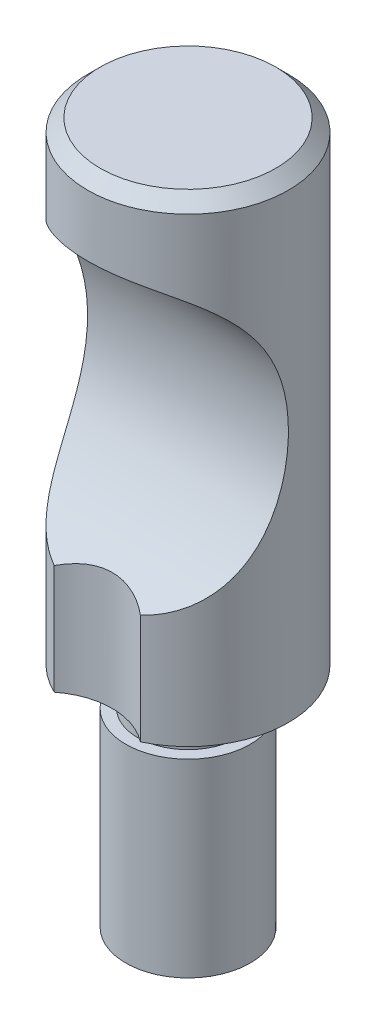
ISO-10303-21;
HEADER;
FILE_DESCRIPTION(('STEP AP214'),'2;1');
FILE_NAME('part.step','',(''),(''),'','','');
FILE_SCHEMA(('AUTOMOTIVE_DESIGN { 1 0 10303 214 1 1 1 1 }'));
ENDSEC;
DATA;
#1=APPLICATION_CONTEXT('core data for automotive mechanical design processes');
#2=APPLICATION_PROTOCOL_DEFINITION('international standard','automotive_design',2000,#1);
#3=PRODUCT_CONTEXT('',#1,'mechanical');
#4=PRODUCT('Part','Part','',(#3));
#5=PRODUCT_RELATED_PRODUCT_CATEGORY('part','',(#4));
#6=PRODUCT_DEFINITION_FORMATION('','',#4);
#7=PRODUCT_DEFINITION_CONTEXT('part definition',#1,'design');
#8=PRODUCT_DEFINITION('design','',#6,#7);
#9=PRODUCT_DEFINITION_SHAPE('','',#8);
#10=(LENGTH_UNIT() NAMED_UNIT(*) SI_UNIT(.MILLI.,.METRE.));
#11=(NAMED_UNIT(*) PLANE_ANGLE_UNIT() SI_UNIT($,.RADIAN.));
#12=(NAMED_UNIT(*) SI_UNIT($,.STERADIAN.) SOLID_ANGLE_UNIT());
#13=UNCERTAINTY_MEASURE_WITH_UNIT(LENGTH_MEASURE(1.E-05),#10,'distance_accuracy_value','');
#14=(GEOMETRIC_REPRESENTATION_CONTEXT(3) GLOBAL_UNCERTAINTY_ASSIGNED_CONTEXT((#13)) GLOBAL_UNIT_ASSIGNED_CONTEXT((#10,
#11,#12)) REPRESENTATION_CONTEXT('',''));
#15=CARTESIAN_POINT('',(0.,0.,0.));
#16=DIRECTION('',(0.,0.,1.));
#17=DIRECTION('',(1.,0.,0.));
#18=AXIS2_PLACEMENT_3D('',#15,#16,#17);
#19=CARTESIAN_POINT('',(0.,0.,0.));
#20=DIRECTION('',(0.,-1.,0.));
#21=DIRECTION('',(0.,0.,-1.));
#22=AXIS2_PLACEMENT_3D('',#19,#20,#21);
#23=CYLINDRICAL_SURFACE('',#22,7.95);
#24=CARTESIAN_POINT('',(0.,54.5,0.));
#25=DIRECTION('',(0.,1.,0.));
#26=DIRECTION('',(0.,0.,1.));
#27=AXIS2_PLACEMENT_3D('',#24,#25,#26);
#28=CIRCLE('',#27,7.95);
#29=CARTESIAN_POINT('',(0.,54.5,7.95));
#30=VERTEX_POINT('',#29);
#31=EDGE_CURVE('E48',#30,#30,#28,.F.);
#32=ORIENTED_EDGE('',*,*,#31,.T.);
#33=EDGE_LOOP('',(#32));
#34=FACE_BOUND('',#33,.T.);
#35=DIRECTION('',(0.,-1.,0.));
#36=VECTOR('',#35,1.);
#37=CARTESIAN_POINT('',(-3.4075021462435,36.75,7.18271739130435));
#38=LINE('',#37,#36);
#39=CARTESIAN_POINT('',(-3.4075021462435,18.,7.18271739130435));
#40=VERTEX_POINT('',#39);
#41=CARTESIAN_POINT('',(-3.4075021462435,26.6873298616435,7.18271739130435));
#42=VERTEX_POINT('',#41);
#43=EDGE_CURVE('E60',#40,#42,#38,.F.);
#44=ORIENTED_EDGE('',*,*,#43,.T.);
#45=CARTESIAN_POINT('',(0.,26.3575131522514,7.95));
#46=CARTESIAN_POINT('',(0.205610023505821,26.3575129536384,7.94999958316512));
#47=CARTESIAN_POINT('',(0.411227374141365,26.3606235819831,7.94201662061066));
#48=CARTESIAN_POINT('',(0.8210412721424,26.3731491044699,7.91016032716961));
#49=CARTESIAN_POINT('',(1.02523774999371,26.3825643048934,7.88628622427825));
#50=CARTESIAN_POINT('',(1.43081933414703,26.407947614691,7.82287618505567));
#51=CARTESIAN_POINT('',(1.63220383442916,26.4239171147381,7.78333692499676));
#52=CARTESIAN_POINT('',(2.03068255356908,26.4628038187699,7.68900172527444));
#53=CARTESIAN_POINT('',(2.22777683487913,26.4857209215465,7.63420600785799));
#54=CARTESIAN_POINT('',(2.61644505792968,26.5390517205701,7.50988572089726));
#55=CARTESIAN_POINT('',(2.80801334996116,26.5694728051423,7.44034664476683));
#56=CARTESIAN_POINT('',(3.18401381871929,26.6384194439544,7.28736907797164));
#57=CARTESIAN_POINT('',(3.36844598511502,26.6769450099266,7.20393056718566));
#58=CARTESIAN_POINT('',(3.72874205993862,26.7627580656182,7.02420781627946));
#59=CARTESIAN_POINT('',(3.9046087977698,26.8100426368568,6.92792785788376));
#60=CARTESIAN_POINT('',(4.24654277724063,26.9140525909243,6.72376537048096));
#61=CARTESIAN_POINT('',(4.41261024493658,26.9707777558556,6.61588310928597));
#62=CARTESIAN_POINT('',(4.73090931028662,27.0931766504316,6.39203995218818));
#63=CARTESIAN_POINT('',(4.88333505121003,27.1586724551468,6.27625776315452));
#64=CARTESIAN_POINT('',(5.17667157571837,27.2998276860129,6.03659189346207));
#65=CARTESIAN_POINT('',(5.31758258748974,27.3754869106776,5.9127083734343));
#66=CARTESIAN_POINT('',(5.58714981582738,27.5372625057778,5.65867059419157));
#67=CARTESIAN_POINT('',(5.71580858473013,27.6233766897391,5.52851764954135));
#68=CARTESIAN_POINT('',(5.96046114085776,27.806194079148,5.26382803137462));
#69=CARTESIAN_POINT('',(6.0764548476483,27.9028973518377,5.12929133002444));
#70=CARTESIAN_POINT('',(6.29475520650987,28.1059947162082,4.85885983183191));
#71=CARTESIAN_POINT('',(6.39716345439542,28.2123055451046,4.72298436882795));
#72=CARTESIAN_POINT('',(6.58951435451526,28.4349881542587,4.45068444411518));
#73=CARTESIAN_POINT('',(6.67945736364822,28.5513596463094,4.31425999823972));
#74=CARTESIAN_POINT('',(6.84732136910528,28.7937698302357,4.04254902909369));
#75=CARTESIAN_POINT('',(6.92523917149974,28.9198110771637,3.90726281713151));
#76=CARTESIAN_POINT('',(7.06968195647296,29.1809943377988,3.63940417116666));
#77=CARTESIAN_POINT('',(7.13620475360295,29.3161380903672,3.50683226202348));
#78=CARTESIAN_POINT('',(7.279265200411,29.6417900071613,3.20186180510781));
#79=CARTESIAN_POINT('',(7.35164841329434,29.835633946193,3.03106151156916));
#80=CARTESIAN_POINT('',(7.47979225882502,30.2368588196692,2.69941557419783));
#81=CARTESIAN_POINT('',(7.5355482825122,30.444243488143,2.53857270027612));
#82=CARTESIAN_POINT('',(7.63296746286851,30.8712910570965,2.22862041303797));
#83=CARTESIAN_POINT('',(7.6746059402103,31.090974684869,2.07953189338724));
#84=CARTESIAN_POINT('',(7.74611693786277,31.5407484241208,1.79491076559948));
#85=CARTESIAN_POINT('',(7.77598898569517,31.7708389530733,1.6593787019818));
#86=CARTESIAN_POINT('',(7.83254122031785,32.2980243454605,1.37127168602363));
#87=CARTESIAN_POINT('',(7.85660872265357,32.5976269248403,1.22276090788931));
#88=CARTESIAN_POINT('',(7.89423260869952,33.2083412979592,0.950024716334078));
#89=CARTESIAN_POINT('',(7.90778657935047,33.5194557167315,0.825804883045881));
#90=CARTESIAN_POINT('',(7.92791528871061,34.150880385205,0.602672057165968));
#91=CARTESIAN_POINT('',(7.93448911957646,34.4711918255164,0.503762357702811));
#92=CARTESIAN_POINT('',(7.94353109023994,35.1187449354678,0.331985341203606));
#93=CARTESIAN_POINT('',(7.94599949746778,35.4459861522908,0.259116328101678));
#94=CARTESIAN_POINT('',(7.94900526568083,36.107943369886,0.139410857332799));
#95=CARTESIAN_POINT('',(7.94952681616871,36.4426984539045,0.0927901419211025));
#96=CARTESIAN_POINT('',(7.95002340712896,37.1148863320719,0.026803753628828));
#97=CARTESIAN_POINT('',(7.94999844225981,37.4523191523601,0.00743834713773243));
#98=CARTESIAN_POINT('',(7.9500011663091,38.127686269726,-0.00391018929229964));
#99=CARTESIAN_POINT('',(7.95002886149367,38.4656206217007,0.00410993951660072));
#100=CARTESIAN_POINT('',(7.94988742202181,39.1397308435553,0.0474863706054928));
#101=CARTESIAN_POINT('',(7.94971828509146,39.4759066930749,0.0828429886913803));
#102=CARTESIAN_POINT('',(7.94806485568619,40.1579939156851,0.182667787699286));
#103=CARTESIAN_POINT('',(7.94652696865767,40.5037399156972,0.24826925200278));
#104=CARTESIAN_POINT('',(7.93990772444326,41.1884864653058,0.408383426238613));
#105=CARTESIAN_POINT('',(7.9348259551145,41.527486225618,0.502899498135208));
#106=CARTESIAN_POINT('',(7.91806932591489,42.1961091264755,0.720093229271605));
#107=CARTESIAN_POINT('',(7.90639585245242,42.5257342234506,0.842764963417421));
#108=CARTESIAN_POINT('',(7.87258728902067,43.1729964887212,1.11521640491437));
#109=CARTESIAN_POINT('',(7.85045516457008,43.49063702765,1.26498842063907));
#110=CARTESIAN_POINT('',(7.79797898049224,44.0393555883926,1.55245550383297));
#111=CARTESIAN_POINT('',(7.77071578859496,44.2734704015778,1.68493931855064));
#112=CARTESIAN_POINT('',(7.70492684759563,44.7315520692773,1.96396257060081));
#113=CARTESIAN_POINT('',(7.66640195940643,44.9555196979934,2.11050093294268));
#114=CARTESIAN_POINT('',(7.57567647958973,45.3914342087936,2.41598169051291));
#115=CARTESIAN_POINT('',(7.5234972320144,45.6033992294134,2.57490445695209));
#116=CARTESIAN_POINT('',(7.4029182258738,46.0140422670805,2.90342755268657));
#117=CARTESIAN_POINT('',(7.33452171336524,46.2127229329422,3.07302574020012));
#118=CARTESIAN_POINT('',(7.19377870403019,46.5591048280581,3.3876068892119));
#119=CARTESIAN_POINT('',(7.12460558322715,46.7093572987701,3.53120556998505));
#120=CARTESIAN_POINT('',(6.97289014521057,46.9992000422717,3.82206677573233));
#121=CARTESIAN_POINT('',(6.89034933667065,47.1387915156455,3.96932888566726));
#122=CARTESIAN_POINT('',(6.71103459609591,47.4065295209105,4.26549686372232));
#123=CARTESIAN_POINT('',(6.61426571999203,47.5346800924241,4.414402130634));
#124=CARTESIAN_POINT('',(6.40589431168517,47.7790153551047,4.71168316119631));
#125=CARTESIAN_POINT('',(6.29429160502673,47.895199905515,4.86005891859848));
#126=CARTESIAN_POINT('',(6.05545085265518,48.1158034453992,5.1546234063245));
#127=CARTESIAN_POINT('',(5.92813627886119,48.2201596848171,5.30079720244309));
#128=CARTESIAN_POINT('',(5.6585427144904,48.4163332090134,5.58767697471985));
#129=CARTESIAN_POINT('',(5.51626349383321,48.5081503009534,5.72838286676383));
#130=CARTESIAN_POINT('',(5.21736345754312,48.6794471634593,6.00188790883852));
#131=CARTESIAN_POINT('',(5.06074122595611,48.758925713862,6.13468627609157));
#132=CARTESIAN_POINT('',(4.73416999664805,48.9059880324918,6.39007775931953));
#133=CARTESIAN_POINT('',(4.56422183268166,48.9735725440283,6.51267151277185));
#134=CARTESIAN_POINT('',(4.22743329075136,49.0921788428782,6.7356161616956));
#135=CARTESIAN_POINT('',(4.06158172886804,49.1441250084645,6.83697320173517));
#136=CARTESIAN_POINT('',(3.72096688086551,49.2392339037014,7.02816066482626));
#137=CARTESIAN_POINT('',(3.54620408096644,49.2823971119329,7.11799171582707));
#138=CARTESIAN_POINT('',(3.18902220016051,49.3605670253804,7.28501932150015));
#139=CARTESIAN_POINT('',(3.00660414462108,49.3955748188675,7.36221756150468));
#140=CARTESIAN_POINT('',(2.63537861926682,49.4580564075226,7.50311225293315));
#141=CARTESIAN_POINT('',(2.44657121397047,49.4855302787413,7.56680884064715));
#142=CARTESIAN_POINT('',(2.07343965191356,49.53230008343,7.67719326157167));
#143=CARTESIAN_POINT('',(1.88936144653008,49.5519355089441,7.72457087997492));
#144=CARTESIAN_POINT('',(1.51770073677745,49.585305498593,7.80610609444287));
#145=CARTESIAN_POINT('',(1.33011693664192,49.5990378338911,7.84025869664082));
#146=CARTESIAN_POINT('',(0.95264793229579,49.6208875027084,7.89501964706795));
#147=CARTESIAN_POINT('',(0.762762579158132,49.6290044708779,7.91562711401265));
#148=CARTESIAN_POINT('',(0.381919983575545,49.6398030725069,7.9431150124357));
#149=CARTESIAN_POINT('',(0.190963151987041,49.6424866632842,7.95000038714116));
#150=CARTESIAN_POINT('',(-0.205610023505823,49.6424870463615,7.94999958316512));
#151=CARTESIAN_POINT('',(-0.411227374141367,49.6393764180168,7.94201662061066));
#152=CARTESIAN_POINT('',(-0.821041272142403,49.6268508955301,7.91016032716961));
#153=CARTESIAN_POINT('',(-1.02523774999371,49.6174356951066,7.88628622427825));
#154=CARTESIAN_POINT('',(-1.43081933414703,49.592052385309,7.82287618505567));
#155=CARTESIAN_POINT('',(-1.63220383442916,49.5760828852619,7.78333692499676));
#156=CARTESIAN_POINT('',(-2.03068255356908,49.5371961812301,7.68900172527444));
#157=CARTESIAN_POINT('',(-2.22777683487913,49.5142790784535,7.63420600785799));
#158=CARTESIAN_POINT('',(-2.61644505792968,49.4609482794299,7.50988572089726));
#159=CARTESIAN_POINT('',(-2.80801334996116,49.4305271948577,7.44034664476683));
#160=CARTESIAN_POINT('',(-3.18401381871929,49.3615805560456,7.28736907797164));
#161=CARTESIAN_POINT('',(-3.36844598511502,49.3230549900734,7.20393056718566));
#162=CARTESIAN_POINT('',(-3.72874205993862,49.2372419343818,7.02420781627946));
#163=CARTESIAN_POINT('',(-3.9046087977698,49.1899573631432,6.92792785788376));
#164=CARTESIAN_POINT('',(-4.24654277724062,49.0859474090757,6.72376537048097));
#165=CARTESIAN_POINT('',(-4.41261024493658,49.0292222441444,6.61588310928597));
#166=CARTESIAN_POINT('',(-4.73090931028662,48.9068233495683,6.39203995218818));
#167=CARTESIAN_POINT('',(-4.88333505121003,48.8413275448531,6.27625776315452));
#168=CARTESIAN_POINT('',(-5.17667157571837,48.700172313987,6.03659189346206));
#169=CARTESIAN_POINT('',(-5.31758258748974,48.6245130893224,5.9127083734343));
#170=CARTESIAN_POINT('',(-5.58714981582738,48.4627374942222,5.65867059419157));
#171=CARTESIAN_POINT('',(-5.71580858473013,48.3766233102609,5.52851764954135));
#172=CARTESIAN_POINT('',(-5.96046114085776,48.193805920852,5.26382803137462));
#173=CARTESIAN_POINT('',(-6.0764548476483,48.0971026481622,5.12929133002444));
#174=CARTESIAN_POINT('',(-6.29475520650987,47.8940052837918,4.85885983183191));
#175=CARTESIAN_POINT('',(-6.39716345439541,47.7876944548954,4.72298436882796));
#176=CARTESIAN_POINT('',(-6.58951435451525,47.5650118457413,4.45068444411519));
#177=CARTESIAN_POINT('',(-6.67945736364822,47.4486403536905,4.31425999823972));
#178=CARTESIAN_POINT('',(-6.84732136910528,47.2062301697643,4.0425490290937));
#179=CARTESIAN_POINT('',(-6.92523917149974,47.0801889228363,3.90726281713152));
#180=CARTESIAN_POINT('',(-7.06968195647296,46.8190056622012,3.63940417116666));
#181=CARTESIAN_POINT('',(-7.13620475360295,46.6838619096328,3.50683226202348));
#182=CARTESIAN_POINT('',(-7.279265200411,46.3582099928387,3.20186180510781));
#183=CARTESIAN_POINT('',(-7.35164841329434,46.164366053807,3.03106151156917));
#184=CARTESIAN_POINT('',(-7.47979225882501,45.7631411803308,2.69941557419783));
#185=CARTESIAN_POINT('',(-7.5355482825122,45.555756511857,2.53857270027613));
#186=CARTESIAN_POINT('',(-7.63296746286851,45.1287089429035,2.22862041303797));
#187=CARTESIAN_POINT('',(-7.6746059402103,44.909025315131,2.07953189338725));
#188=CARTESIAN_POINT('',(-7.74611693786277,44.4592515758792,1.79491076559948));
#189=CARTESIAN_POINT('',(-7.77598898569517,44.2291610469267,1.6593787019818));
#190=CARTESIAN_POINT('',(-7.83254122031785,43.7019756545395,1.37127168602363));
#191=CARTESIAN_POINT('',(-7.85660872265357,43.4023730751597,1.22276090788932));
#192=CARTESIAN_POINT('',(-7.89423260869952,42.7916587020408,0.95002471633408));
#193=CARTESIAN_POINT('',(-7.90778657935047,42.4805442832685,0.825804883045883));
#194=CARTESIAN_POINT('',(-7.92791528871061,41.849119614795,0.60267205716597));
#195=CARTESIAN_POINT('',(-7.93448911957646,41.5288081744836,0.503762357702812));
#196=CARTESIAN_POINT('',(-7.94353109023994,40.8812550645322,0.331985341203607));
#197=CARTESIAN_POINT('',(-7.94599949746778,40.5540138477092,0.25911632810168));
#198=CARTESIAN_POINT('',(-7.94900526568083,39.892056630114,0.139410857332801));
#199=CARTESIAN_POINT('',(-7.94952681616871,39.5573015460955,0.0927901419211039));
#200=CARTESIAN_POINT('',(-7.95002340712896,38.8851136679281,0.0268037536288284));
#201=CARTESIAN_POINT('',(-7.94999844225981,38.5476808476399,0.0074383471377322));
#202=CARTESIAN_POINT('',(-7.9500011663091,37.872313730274,-0.00391018929230083));
#203=CARTESIAN_POINT('',(-7.95002886149366,37.5343793782993,0.0041099395165994));
#204=CARTESIAN_POINT('',(-7.94988742202181,36.8602691564447,0.0474863706054922));
#205=CARTESIAN_POINT('',(-7.94971828509146,36.5240933069251,0.0828429886913804));
#206=CARTESIAN_POINT('',(-7.9480648556862,35.8420060843149,0.182667787699284));
#207=CARTESIAN_POINT('',(-7.94652696865767,35.4962600843028,0.248269252002774));
#208=CARTESIAN_POINT('',(-7.93990772444326,34.8115135346942,0.408383426238606));
#209=CARTESIAN_POINT('',(-7.9348259551145,34.472513774382,0.502899498135202));
#210=CARTESIAN_POINT('',(-7.91806932591489,33.8038908735245,0.7200932292716));
#211=CARTESIAN_POINT('',(-7.90639585245242,33.4742657765494,0.842764963417416));
#212=CARTESIAN_POINT('',(-7.87258728902067,32.8270035112788,1.11521640491437));
#213=CARTESIAN_POINT('',(-7.85045516457008,32.50936297235,1.26498842063906));
#214=CARTESIAN_POINT('',(-7.79797898049224,31.9606444116074,1.55245550383296));
#215=CARTESIAN_POINT('',(-7.77071578859496,31.7265295984222,1.68493931855063));
#216=CARTESIAN_POINT('',(-7.70492684759563,31.2684479307227,1.9639625706008));
#217=CARTESIAN_POINT('',(-7.66640195940644,31.0444803020066,2.11050093294267));
#218=CARTESIAN_POINT('',(-7.57567647958974,30.6085657912064,2.4159816905129));
#219=CARTESIAN_POINT('',(-7.5234972320144,30.3966007705866,2.57490445695208));
#220=CARTESIAN_POINT('',(-7.40291822587381,29.9859577329195,2.90342755268656));
#221=CARTESIAN_POINT('',(-7.33452171336524,29.7872770670578,3.07302574020011));
#222=CARTESIAN_POINT('',(-7.1937787040302,29.4408951719419,3.38760688921189));
#223=CARTESIAN_POINT('',(-7.12460558322715,29.2906427012299,3.53120556998504));
#224=CARTESIAN_POINT('',(-6.97289014521058,29.0007999577283,3.82206677573232));
#225=CARTESIAN_POINT('',(-6.89034933667066,28.8612084843545,3.96932888566726));
#226=CARTESIAN_POINT('',(-6.71103459609591,28.5934704790895,4.26549686372231));
#227=CARTESIAN_POINT('',(-6.61426571999203,28.4653199075759,4.41440213063399));
#228=CARTESIAN_POINT('',(-6.40589431168518,28.2209846448953,4.7116831611963));
#229=CARTESIAN_POINT('',(-6.29429160502673,28.104800094485,4.86005891859848));
#230=CARTESIAN_POINT('',(-6.05545085265519,27.8841965546008,5.15462340632449));
#231=CARTESIAN_POINT('',(-5.9281362788612,27.7798403151829,5.30079720244308));
#232=CARTESIAN_POINT('',(-5.65854271449041,27.5836667909866,5.58767697471984));
#233=CARTESIAN_POINT('',(-5.51626349383322,27.4918496990466,5.72838286676383));
#234=CARTESIAN_POINT('',(-5.21736345754313,27.3205528365407,6.00188790883852));
#235=CARTESIAN_POINT('',(-5.06074122595612,27.241074286138,6.13468627609156));
#236=CARTESIAN_POINT('',(-4.73416999664805,27.0940119675082,6.39007775931953));
#237=CARTESIAN_POINT('',(-4.56422183268167,27.0264274559717,6.51267151277185));
#238=CARTESIAN_POINT('',(-4.22743329075137,26.9078211571218,6.7356161616956));
#239=CARTESIAN_POINT('',(-4.06158172886805,26.8558749915355,6.83697320173517));
#240=CARTESIAN_POINT('',(-3.72096688086551,26.7607660962986,7.02816066482626));
#241=CARTESIAN_POINT('',(-3.54620408096644,26.7176028880671,7.11799171582707));
#242=CARTESIAN_POINT('',(-3.18902220016051,26.6394329746196,7.28501932150015));
#243=CARTESIAN_POINT('',(-3.00660414462108,26.6044251811325,7.36221756150468));
#244=CARTESIAN_POINT('',(-2.63537861926682,26.5419435924774,7.50311225293314));
#245=CARTESIAN_POINT('',(-2.44657121397048,26.5144697212587,7.56680884064714));
#246=CARTESIAN_POINT('',(-2.07343965191356,26.46769991657,7.67719326157167));
#247=CARTESIAN_POINT('',(-1.88936144653008,26.4480644910559,7.72457087997492));
#248=CARTESIAN_POINT('',(-1.51770073677746,26.414694501407,7.80610609444287));
#249=CARTESIAN_POINT('',(-1.33011693664192,26.4009621661089,7.84025869664082));
#250=CARTESIAN_POINT('',(-0.952647932295796,26.3791124972915,7.89501964706795));
#251=CARTESIAN_POINT('',(-0.762762579158139,26.3709955291221,7.91562711401265));
#252=CARTESIAN_POINT('',(-0.38191998357555,26.3601969274931,7.9431150124357));
#253=CARTESIAN_POINT('',(-0.190963151987044,26.3575133367158,7.95000038714116));
#254=CARTESIAN_POINT('',(0.,26.3575131522514,7.95));
#255=B_SPLINE_CURVE_WITH_KNOTS('',3,(#45,#46,#47,#48,#49,#50,#51,#52,#53,#54,#55,#56,#57,#58,
#59,#60,#61,#62,#63,#64,#65,#66,#67,#68,#69,#70,#71,#72,#73,#74,#75,#76,#77,#78,#79,#80,#81,#82,
#83,#84,#85,#86,#87,#88,#89,#90,#91,#92,#93,#94,#95,#96,#97,#98,#99,#100,#101,#102,#103,#104,
#105,#106,#107,#108,#109,#110,#111,#112,#113,#114,#115,#116,#117,#118,#119,#120,#121,#122,#123,
#124,#125,#126,#127,#128,#129,#130,#131,#132,#133,#134,#135,#136,#137,#138,#139,#140,#141,#142,
#143,#144,#145,#146,#147,#148,#149,#150,#151,#152,#153,#154,#155,#156,#157,#158,#159,#160,#161,
#162,#163,#164,#165,#166,#167,#168,#169,#170,#171,#172,#173,#174,#175,#176,#177,#178,#179,#180,
#181,#182,#183,#184,#185,#186,#187,#188,#189,#190,#191,#192,#193,#194,#195,#196,#197,#198,#199,
#200,#201,#202,#203,#204,#205,#206,#207,#208,#209,#210,#211,#212,#213,#214,#215,#216,#217,#218,
#219,#220,#221,#222,#223,#224,#225,#226,#227,#228,#229,#230,#231,#232,#233,#234,#235,#236,#237,
#238,#239,#240,#241,#242,#243,#244,#245,#246,#247,#248,#249,#250,#251,#252,#253,#254),
.UNSPECIFIED.,.T.,.F.,(4,2,2,2,2,2,2,2,2,2,2,2,2,2,2,2,2,2,2,2,2,2,2,2,2,2,2,2,2,2,2,2,2,2,2,2,
2,2,2,2,2,2,2,2,2,2,2,2,2,2,2,2,2,2,2,2,2,2,2,2,2,2,2,2,2,2,2,2,2,2,2,2,2,2,2,2,2,2,2,2,2,2,2,2,
2,2,2,2,2,2,2,2,2,2,2,2,2,2,2,2,2,2,2,2,4),(0.,0.616664387632868,1.23335873551905,
1.85018399959646,2.46700027860119,3.08442630827778,3.70185323176519,4.31907479883088,
4.9362821218334,5.54246559378492,6.14863705013427,6.75468195385779,7.36073070627788,
7.96195549459572,8.5631630653794,9.16453004483343,9.76601223167505,10.569753080711,
11.3737165153886,12.1790782236012,12.9844722676318,13.9888807879307,14.9935197712944,
15.9982894029224,17.0029935805839,18.0158394661869,19.0286952511318,20.0416715652749,
21.0546595820427,22.1091470199199,23.1637571119724,24.2181454744161,25.2722350474696,
26.0826631077262,26.8930292301058,27.7021361037613,28.5110811626514,29.1675802911682,
29.8240053789379,30.4801977678839,31.1363978747611,31.7959306013494,32.4554734696894,
33.1150815189913,33.774648331918,34.3775138883072,34.9803465859204,35.58309879447,
36.1858449183529,36.7585336148766,37.331438352623,37.9043803614687,38.4771159371601,
39.093780324793,39.7104746726792,40.3272999367566,40.9441162157613,41.5615422454379,
42.1789691689253,42.796190735991,43.4133980589936,44.0195815309451,44.6257529872944,
45.2317978910179,45.837846643438,46.4390714317559,47.0402790025395,47.6416459819936,
48.2431281688352,49.0468690178712,49.8508324525488,50.6561941607614,51.461588204792,
52.4659967250908,53.4706357084545,54.4754053400826,55.480109517744,56.4929554033471,
57.5058111882919,58.5187875024351,59.5317755192029,60.5862629570801,61.6408730491326,
62.6952614115763,63.7493509846297,64.5597790448863,65.3701451672659,66.1792520409215,
66.9881970998116,67.6446962283284,68.3011213160981,68.9573137050441,69.6135138119212,
70.2730465385096,70.9325894068496,71.5921974561514,72.2517642690781,72.8546298254674,
73.4574625230806,74.0602147316301,74.6629608555131,75.2356495520367,75.8085542897831,
76.3814962986289,76.9542318743203),.UNSPECIFIED.);
#256=CARTESIAN_POINT('',(3.4075021462435,26.6873298616435,7.18271739130435));
#257=VERTEX_POINT('',#256);
#258=EDGE_CURVE('E76',#257,#42,#255,.T.);
#259=ORIENTED_EDGE('',*,*,#258,.F.);
#260=DIRECTION('',(0.,-1.,0.));
#261=VECTOR('',#260,1.);
#262=CARTESIAN_POINT('',(3.4075021462435,36.75,7.18271739130435));
#263=LINE('',#262,#261);
#264=CARTESIAN_POINT('',(3.4075021462435,18.,7.18271739130435));
#265=VERTEX_POINT('',#264);
#266=EDGE_CURVE('E55',#257,#265,#263,.T.);
#267=ORIENTED_EDGE('',*,*,#266,.T.);
#268=CARTESIAN_POINT('',(0.,18.,0.));
#269=DIRECTION('',(0.,-1.,0.));
#270=DIRECTION('',(0.,0.,-1.));
#271=AXIS2_PLACEMENT_3D('',#268,#269,#270);
#272=CIRCLE('',#271,7.95000000000001);
#273=EDGE_CURVE('E74',#40,#265,#272,.T.);
#274=ORIENTED_EDGE('',*,*,#273,.F.);
#275=EDGE_LOOP('',(#44,#259,#267,#274));
#276=FACE_BOUND('',#275,.T.);
#277=ADVANCED_FACE('F39',(#34,#276),#23,.T.);
#278=CARTESIAN_POINT('',(0.,55.5,0.));
#279=DIRECTION('',(0.,1.,0.));
#280=DIRECTION('',(0.,0.,1.));
#281=AXIS2_PLACEMENT_3D('',#278,#279,#280);
#282=PLANE('',#281);
#283=CARTESIAN_POINT('',(0.,55.5,0.));
#284=DIRECTION('',(0.,1.,0.));
#285=DIRECTION('',(0.,0.,1.));
#286=AXIS2_PLACEMENT_3D('',#283,#284,#285);
#287=CIRCLE('',#286,6.94999999999998);
#288=CARTESIAN_POINT('',(0.,55.5,6.94999999999998));
#289=VERTEX_POINT('',#288);
#290=EDGE_CURVE('E11',#289,#289,#287,.T.);
#291=ORIENTED_EDGE('',*,*,#290,.T.);
#292=EDGE_LOOP('',(#291));
#293=FACE_BOUND('',#292,.T.);
#294=ADVANCED_FACE('F122',(#293),#282,.T.);
#295=CARTESIAN_POINT('',(7.95000000000001,18.,0.));
#296=DIRECTION('',(0.,-1.,0.));
#297=DIRECTION('',(0.,0.,-1.));
#298=AXIS2_PLACEMENT_3D('',#295,#296,#297);
#299=PLANE('',#298);
#300=CARTESIAN_POINT('',(0.,18.,11.5));
#301=DIRECTION('',(0.,-1.,0.));
#302=DIRECTION('',(0.,0.,-1.));
#303=AXIS2_PLACEMENT_3D('',#300,#301,#302);
#304=CIRCLE('',#303,5.5);
#305=EDGE_CURVE('E65',#40,#265,#304,.T.);
#306=ORIENTED_EDGE('',*,*,#305,.F.);
#307=ORIENTED_EDGE('',*,*,#273,.T.);
#308=EDGE_LOOP('',(#306,#307));
#309=FACE_BOUND('',#308,.T.);
#310=CARTESIAN_POINT('',(0.,18.,0.));
#311=DIRECTION('',(0.,-1.,0.));
#312=DIRECTION('',(0.,0.,-1.));
#313=AXIS2_PLACEMENT_3D('',#310,#311,#312);
#314=CIRCLE('',#313,4.);
#315=CARTESIAN_POINT('',(0.,18.,-4.));
#316=VERTEX_POINT('',#315);
#317=EDGE_CURVE('E80',#316,#316,#314,.T.);
#318=ORIENTED_EDGE('',*,*,#317,.F.);
#319=EDGE_LOOP('',(#318));
#320=FACE_BOUND('',#319,.T.);
#321=ADVANCED_FACE('F78',(#309,#320),#299,.T.);
#322=CARTESIAN_POINT('',(0.,0.,0.));
#323=DIRECTION('',(0.,-1.,0.));
#324=DIRECTION('',(0.,0.,-1.));
#325=AXIS2_PLACEMENT_3D('',#322,#323,#324);
#326=CYLINDRICAL_SURFACE('',#325,4.);
#327=ORIENTED_EDGE('',*,*,#317,.T.);
#328=EDGE_LOOP('',(#327));
#329=FACE_BOUND('',#328,.T.);
#330=CARTESIAN_POINT('',(0.,15.,0.));
#331=DIRECTION('',(0.,-1.,0.));
#332=DIRECTION('',(0.,0.,-1.));
#333=AXIS2_PLACEMENT_3D('',#330,#331,#332);
#334=CIRCLE('',#333,4.);
#335=CARTESIAN_POINT('',(0.,15.,-4.));
#336=VERTEX_POINT('',#335);
#337=EDGE_CURVE('E84',#336,#336,#334,.T.);
#338=ORIENTED_EDGE('',*,*,#337,.F.);
#339=EDGE_LOOP('',(#338));
#340=FACE_BOUND('',#339,.T.);
#341=ADVANCED_FACE('F132',(#329,#340),#326,.T.);
#342=CARTESIAN_POINT('',(4.,15.,0.));
#343=DIRECTION('',(0.,1.,0.));
#344=DIRECTION('',(0.,0.,1.));
#345=AXIS2_PLACEMENT_3D('',#342,#343,#344);
#346=PLANE('',#345);
#347=ORIENTED_EDGE('',*,*,#337,.T.);
#348=EDGE_LOOP('',(#347));
#349=FACE_BOUND('',#348,.T.);
#350=CARTESIAN_POINT('',(0.,15.,0.));
#351=DIRECTION('',(0.,-1.,0.));
#352=DIRECTION('',(0.,0.,-1.));
#353=AXIS2_PLACEMENT_3D('',#350,#351,#352);
#354=CIRCLE('',#353,4.925);
#355=CARTESIAN_POINT('',(0.,15.,-4.925));
#356=VERTEX_POINT('',#355);
#357=EDGE_CURVE('E89',#356,#356,#354,.T.);
#358=ORIENTED_EDGE('',*,*,#357,.F.);
#359=EDGE_LOOP('',(#358));
#360=FACE_BOUND('',#359,.T.);
#361=ADVANCED_FACE('F135',(#349,#360),#346,.T.);
#362=CARTESIAN_POINT('',(0.,0.,0.));
#363=DIRECTION('',(0.,-1.,0.));
#364=DIRECTION('',(0.,0.,-1.));
#365=AXIS2_PLACEMENT_3D('',#362,#363,#364);
#366=CYLINDRICAL_SURFACE('',#365,4.925);
#367=ORIENTED_EDGE('',*,*,#357,.T.);
#368=EDGE_LOOP('',(#367));
#369=FACE_BOUND('',#368,.T.);
#370=CARTESIAN_POINT('',(0.,0.,0.));
#371=DIRECTION('',(0.,-1.,0.));
#372=DIRECTION('',(0.,0.,-1.));
#373=AXIS2_PLACEMENT_3D('',#370,#371,#372);
#374=CIRCLE('',#373,4.925);
#375=CARTESIAN_POINT('',(0.,0.,-4.925));
#376=VERTEX_POINT('',#375);
#377=EDGE_CURVE('E92',#376,#376,#374,.T.);
#378=ORIENTED_EDGE('',*,*,#377,.F.);
#379=EDGE_LOOP('',(#378));
#380=FACE_BOUND('',#379,.T.);
#381=ADVANCED_FACE('F139',(#369,#380),#366,.T.);
#382=CARTESIAN_POINT('',(4.925,0.,0.));
#383=DIRECTION('',(0.,-1.,0.));
#384=DIRECTION('',(0.,0.,-1.));
#385=AXIS2_PLACEMENT_3D('',#382,#383,#384);
#386=PLANE('',#385);
#387=ORIENTED_EDGE('',*,*,#377,.T.);
#388=EDGE_LOOP('',(#387));
#389=FACE_BOUND('',#388,.T.);
#390=ADVANCED_FACE('F119',(#389),#386,.T.);
#391=CARTESIAN_POINT('',(7.951,38.,12.5));
#392=DIRECTION('',(-1.,0.,0.));
#393=DIRECTION('',(0.,0.,1.));
#394=AXIS2_PLACEMENT_3D('',#391,#392,#393);
#395=CYLINDRICAL_SURFACE('',#394,12.5);
#396=CARTESIAN_POINT('',(-4.33718775444215,26.2932951733031,8.11787014106243));
#397=CARTESIAN_POINT('',(-4.24080523183596,26.3395501835672,7.99427437426713));
#398=CARTESIAN_POINT('',(-4.13926462716029,26.3864574505274,7.87495179409824));
#399=CARTESIAN_POINT('',(-3.92641585289589,26.4805207111294,7.64542265391635));
#400=CARTESIAN_POINT('',(-3.8151058799552,26.5276767491761,7.53521778428865));
#401=CARTESIAN_POINT('',(-3.58261242529391,26.621442395479,7.32391219281263));
#402=CARTESIAN_POINT('',(-3.4613740625056,26.6680470734,7.22286963276447));
#403=CARTESIAN_POINT('',(-3.21018987348053,26.7592639630065,7.03126079078234));
#404=CARTESIAN_POINT('',(-3.08024476154619,26.8038763376415,6.94069365110196));
#405=CARTESIAN_POINT('',(-2.81190401553595,26.8900247267756,6.77046449692101));
#406=CARTESIAN_POINT('',(-2.67348711766854,26.9315523684046,6.69083169812149));
#407=CARTESIAN_POINT('',(-2.38931473608302,27.0101308658857,6.54351228689066));
#408=CARTESIAN_POINT('',(-2.24356362570236,27.047184345864,6.47581866121474));
#409=CARTESIAN_POINT('',(-1.9458649824076,27.1155213923891,6.35320851987378));
#410=CARTESIAN_POINT('',(-1.79393216964135,27.1468177866323,6.29826352500956));
#411=CARTESIAN_POINT('',(-1.48466762140349,27.2025686569828,6.20169916966336));
#412=CARTESIAN_POINT('',(-1.3273366339242,27.2270240767385,6.16007797117382));
#413=CARTESIAN_POINT('',(-1.02225576297199,27.2663298168559,6.09377809271177));
#414=CARTESIAN_POINT('',(-0.874837141279029,27.2818226973038,6.06795490883205));
#415=CARTESIAN_POINT('',(-0.577822064096003,27.3056673496245,6.02838601566672));
#416=CARTESIAN_POINT('',(-0.428225875658625,27.3140199897825,6.01463883787876));
#417=CARTESIAN_POINT('',(-0.128204372410657,27.3232567698488,5.99944356823854));
#418=CARTESIAN_POINT('',(0.0222207966020223,27.324142183598,5.99799337863146));
#419=CARTESIAN_POINT('',(0.322532915727075,27.3184124994262,6.0074104542529));
#420=CARTESIAN_POINT('',(0.472419901062682,27.3117979016877,6.01827689807393));
#421=CARTESIAN_POINT('',(0.753579709754072,27.2924808613314,6.05024525725819));
#422=CARTESIAN_POINT('',(0.885053618363224,27.2805450073065,6.07006151779263));
#423=CARTESIAN_POINT('',(1.14566554058926,27.2513366443265,6.11900976574763));
#424=CARTESIAN_POINT('',(1.27480282071709,27.2340624893715,6.14814462654184));
#425=CARTESIAN_POINT('',(1.65747150112119,27.1749335047496,6.24907185414541));
#426=CARTESIAN_POINT('',(1.90644404885988,27.1257584478661,6.33440833209392));
#427=CARTESIAN_POINT('',(2.39900848985463,27.0099534417205,6.54317728980821));
#428=CARTESIAN_POINT('',(2.64167602121192,26.942560239874,6.66833296786122));
#429=CARTESIAN_POINT('',(3.10383747726823,26.7978366943201,6.95141785469554));
#430=CARTESIAN_POINT('',(3.32332735818308,26.7205046217875,7.10935276823408));
#431=CARTESIAN_POINT('',(3.67881869811756,26.5838576377689,7.40681221922675));
#432=CARTESIAN_POINT('',(3.82111734712204,26.5254776728699,7.53934026830787));
#433=CARTESIAN_POINT('',(4.09060237173142,26.4088308533772,7.81836350855431));
#434=CARTESIAN_POINT('',(4.21782271275111,26.3505640470297,7.96482591460141));
#435=CARTESIAN_POINT('',(4.33718775444215,26.2932951733031,8.11787014106243));
#436=B_SPLINE_CURVE_WITH_KNOTS('',3,(#396,#397,#398,#399,#400,#401,#402,#403,#404,#405,#406,
#407,#408,#409,#410,#411,#412,#413,#414,#415,#416,#417,#418,#419,#420,#421,#422,#423,#424,#425,
#426,#427,#428,#429,#430,#431,#432,#433,#434,#435),.UNSPECIFIED.,.F.,.F.,(4,2,2,2,2,2,2,2,2,2,2,
2,2,2,2,2,2,2,2,4),(0.,0.490106118431517,0.980302897815041,1.47342061129185,1.96649791876891,
2.46086806733088,2.95494684137731,3.4479110304348,3.9408071861239,4.39155169290892,
4.84224137933114,5.29285418062738,5.7434369319136,6.14344869166497,6.54358391342698,
7.34330277459386,8.18386886841668,9.02458137360069,9.63268474124041,10.2393911558024),.UNSPECIFIED.);
#437=EDGE_CURVE('E70',#42,#257,#436,.T.);
#438=ORIENTED_EDGE('',*,*,#437,.T.);
#439=ORIENTED_EDGE('',*,*,#258,.T.);
#440=EDGE_LOOP('',(#438,#439));
#441=FACE_BOUND('',#440,.T.);
#442=ADVANCED_FACE('F107',(#441),#395,.F.);
#443=CARTESIAN_POINT('',(0.,55.501,11.5));
#444=DIRECTION('',(0.,-1.,0.));
#445=DIRECTION('',(0.,0.,-1.));
#446=AXIS2_PLACEMENT_3D('',#443,#444,#445);
#447=CYLINDRICAL_SURFACE('',#446,5.5);
#448=ORIENTED_EDGE('',*,*,#437,.F.);
#449=ORIENTED_EDGE('',*,*,#43,.F.);
#450=ORIENTED_EDGE('',*,*,#305,.T.);
#451=ORIENTED_EDGE('',*,*,#266,.F.);
#452=EDGE_LOOP('',(#448,#449,#450,#451));
#453=FACE_BOUND('',#452,.T.);
#454=ADVANCED_FACE('F66',(#453),#447,.F.);
#455=CARTESIAN_POINT('',(0.,54.5,0.));
#456=DIRECTION('',(0.,-1.,0.));
#457=DIRECTION('',(0.,0.,-1.));
#458=AXIS2_PLACEMENT_3D('',#455,#456,#457);
#459=CONICAL_SURFACE('',#458,7.95,0.785398163397453);
#460=ORIENTED_EDGE('',*,*,#290,.F.);
#461=EDGE_LOOP('',(#460));
#462=FACE_BOUND('',#461,.T.);
#463=ORIENTED_EDGE('',*,*,#31,.F.);
#464=EDGE_LOOP('',(#463));
#465=FACE_BOUND('',#464,.T.);
#466=ADVANCED_FACE('F42',(#462,#465),#459,.T.);
#467=CLOSED_SHELL('',(#277,#294,#321,#341,#361,#381,#390,#442,#454,#466));
#468=MANIFOLD_SOLID_BREP('B2',#467);
#469=ADVANCED_BREP_SHAPE_REPRESENTATION('',(#18,#468),#14);
#470=SHAPE_DEFINITION_REPRESENTATION(#9,#469);
ENDSEC;
END-ISO-10303-21;
